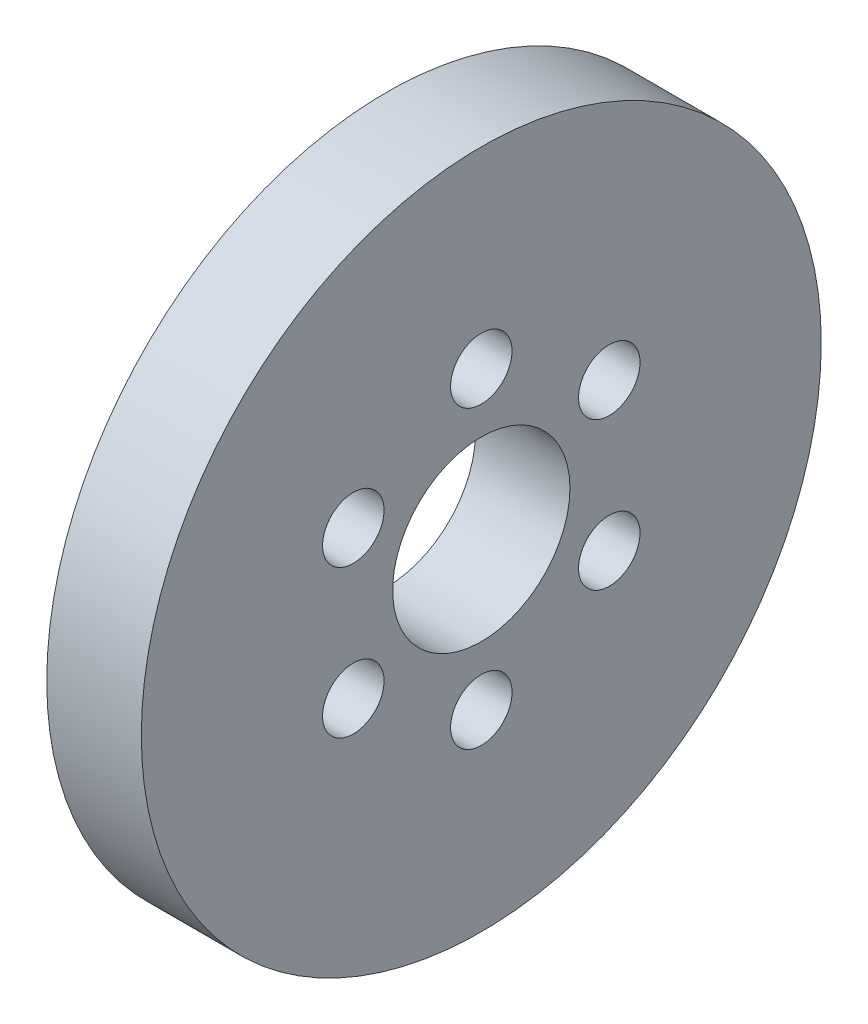
ISO-10303-21;
HEADER;
FILE_DESCRIPTION(('STEP AP214'),'2;1');
FILE_NAME('part.step','',(''),(''),'','','');
FILE_SCHEMA(('AUTOMOTIVE_DESIGN { 1 0 10303 214 1 1 1 1 }'));
ENDSEC;
DATA;
#1=APPLICATION_CONTEXT('core data for automotive mechanical design processes');
#2=APPLICATION_PROTOCOL_DEFINITION('international standard','automotive_design',2000,#1);
#3=PRODUCT_CONTEXT('',#1,'mechanical');
#4=PRODUCT('Part','Part','',(#3));
#5=PRODUCT_RELATED_PRODUCT_CATEGORY('part','',(#4));
#6=PRODUCT_DEFINITION_FORMATION('','',#4);
#7=PRODUCT_DEFINITION_CONTEXT('part definition',#1,'design');
#8=PRODUCT_DEFINITION('design','',#6,#7);
#9=PRODUCT_DEFINITION_SHAPE('','',#8);
#10=(LENGTH_UNIT() NAMED_UNIT(*) SI_UNIT(.MILLI.,.METRE.));
#11=(NAMED_UNIT(*) PLANE_ANGLE_UNIT() SI_UNIT($,.RADIAN.));
#12=(NAMED_UNIT(*) SI_UNIT($,.STERADIAN.) SOLID_ANGLE_UNIT());
#13=UNCERTAINTY_MEASURE_WITH_UNIT(LENGTH_MEASURE(1.E-05),#10,'distance_accuracy_value','');
#14=(GEOMETRIC_REPRESENTATION_CONTEXT(3) GLOBAL_UNCERTAINTY_ASSIGNED_CONTEXT((#13)) GLOBAL_UNIT_ASSIGNED_CONTEXT((#10,
#11,#12)) REPRESENTATION_CONTEXT('',''));
#15=CARTESIAN_POINT('',(0.,0.,0.));
#16=DIRECTION('',(0.,0.,1.));
#17=DIRECTION('',(1.,0.,0.));
#18=AXIS2_PLACEMENT_3D('',#15,#16,#17);
#19=CARTESIAN_POINT('',(5.08,0.,0.));
#20=DIRECTION('',(-1.,0.,0.));
#21=DIRECTION('',(0.,0.,1.));
#22=AXIS2_PLACEMENT_3D('',#19,#20,#21);
#23=CYLINDRICAL_SURFACE('',#22,18.26006);
#24=CARTESIAN_POINT('',(5.08,0.,0.));
#25=DIRECTION('',(1.,0.,0.));
#26=DIRECTION('',(0.,0.,-1.));
#27=AXIS2_PLACEMENT_3D('',#24,#25,#26);
#28=CIRCLE('',#27,18.26006);
#29=CARTESIAN_POINT('',(5.08,0.,-18.26006));
#30=VERTEX_POINT('',#29);
#31=EDGE_CURVE('E10',#30,#30,#28,.T.);
#32=ORIENTED_EDGE('',*,*,#31,.F.);
#33=EDGE_LOOP('',(#32));
#34=FACE_BOUND('',#33,.T.);
#35=CARTESIAN_POINT('',(0.,0.,0.));
#36=DIRECTION('',(1.,0.,0.));
#37=DIRECTION('',(0.,0.,-1.));
#38=AXIS2_PLACEMENT_3D('',#35,#36,#37);
#39=CIRCLE('',#38,18.26006);
#40=CARTESIAN_POINT('',(0.,0.,-18.26006));
#41=VERTEX_POINT('',#40);
#42=EDGE_CURVE('E36',#41,#41,#39,.T.);
#43=ORIENTED_EDGE('',*,*,#42,.T.);
#44=EDGE_LOOP('',(#43));
#45=FACE_BOUND('',#44,.T.);
#46=ADVANCED_FACE('F33',(#34,#45),#23,.T.);
#47=CARTESIAN_POINT('',(5.08,0.,0.));
#48=DIRECTION('',(1.,0.,0.));
#49=DIRECTION('',(0.,0.,-1.));
#50=AXIS2_PLACEMENT_3D('',#47,#48,#49);
#51=PLANE('',#50);
#52=CARTESIAN_POINT('',(5.08,0.,0.));
#53=DIRECTION('',(1.,0.,0.));
#54=DIRECTION('',(0.,0.,-1.));
#55=AXIS2_PLACEMENT_3D('',#52,#53,#54);
#56=CIRCLE('',#55,4.76249999999999);
#57=CARTESIAN_POINT('',(5.08,0.,-4.76249999999999));
#58=VERTEX_POINT('',#57);
#59=EDGE_CURVE('E83',#58,#58,#56,.T.);
#60=ORIENTED_EDGE('',*,*,#59,.F.);
#61=EDGE_LOOP('',(#60));
#62=FACE_BOUND('',#61,.T.);
#63=CARTESIAN_POINT('',(5.08,7.9375,0.));
#64=DIRECTION('',(1.,0.,0.));
#65=DIRECTION('',(0.,0.,-1.));
#66=AXIS2_PLACEMENT_3D('',#63,#64,#65);
#67=CIRCLE('',#66,1.65099999999999);
#68=CARTESIAN_POINT('',(5.08,7.9375,-1.65099999999999));
#69=VERTEX_POINT('',#68);
#70=EDGE_CURVE('E77',#69,#69,#67,.T.);
#71=ORIENTED_EDGE('',*,*,#70,.F.);
#72=EDGE_LOOP('',(#71));
#73=FACE_BOUND('',#72,.T.);
#74=CARTESIAN_POINT('',(5.08,3.96874999999998,-6.87407664253899));
#75=DIRECTION('',(1.,0.,0.));
#76=DIRECTION('',(0.,0.,-1.));
#77=AXIS2_PLACEMENT_3D('',#74,#75,#76);
#78=CIRCLE('',#77,1.65099999999999);
#79=CARTESIAN_POINT('',(5.08,3.96874999999998,-8.52507664253898));
#80=VERTEX_POINT('',#79);
#81=EDGE_CURVE('E71',#80,#80,#78,.T.);
#82=ORIENTED_EDGE('',*,*,#81,.F.);
#83=EDGE_LOOP('',(#82));
#84=FACE_BOUND('',#83,.T.);
#85=CARTESIAN_POINT('',(5.08,-3.96875000000003,-6.87407664253896));
#86=DIRECTION('',(1.,0.,0.));
#87=DIRECTION('',(0.,0.,-1.));
#88=AXIS2_PLACEMENT_3D('',#85,#86,#87);
#89=CIRCLE('',#88,1.65099999999999);
#90=CARTESIAN_POINT('',(5.08,-3.96875000000003,-8.52507664253895));
#91=VERTEX_POINT('',#90);
#92=EDGE_CURVE('E65',#91,#91,#89,.T.);
#93=ORIENTED_EDGE('',*,*,#92,.F.);
#94=EDGE_LOOP('',(#93));
#95=FACE_BOUND('',#94,.T.);
#96=CARTESIAN_POINT('',(5.08,-7.9375,0.));
#97=DIRECTION('',(1.,0.,0.));
#98=DIRECTION('',(0.,0.,-1.));
#99=AXIS2_PLACEMENT_3D('',#96,#97,#98);
#100=CIRCLE('',#99,1.65099999999999);
#101=CARTESIAN_POINT('',(5.08,-7.9375,-1.65099999999993));
#102=VERTEX_POINT('',#101);
#103=EDGE_CURVE('E59',#102,#102,#100,.T.);
#104=ORIENTED_EDGE('',*,*,#103,.F.);
#105=EDGE_LOOP('',(#104));
#106=FACE_BOUND('',#105,.T.);
#107=CARTESIAN_POINT('',(5.08,-3.96874999999994,6.87407664253902));
#108=DIRECTION('',(1.,0.,0.));
#109=DIRECTION('',(0.,0.,-1.));
#110=AXIS2_PLACEMENT_3D('',#107,#108,#109);
#111=CIRCLE('',#110,1.65099999999999);
#112=CARTESIAN_POINT('',(5.08,-3.96874999999994,5.22307664253903));
#113=VERTEX_POINT('',#112);
#114=EDGE_CURVE('E53',#113,#113,#111,.T.);
#115=ORIENTED_EDGE('',*,*,#114,.F.);
#116=EDGE_LOOP('',(#115));
#117=FACE_BOUND('',#116,.T.);
#118=CARTESIAN_POINT('',(5.08,3.96875000000008,6.87407664253894));
#119=DIRECTION('',(1.,0.,0.));
#120=DIRECTION('',(0.,0.,-1.));
#121=AXIS2_PLACEMENT_3D('',#118,#119,#120);
#122=CIRCLE('',#121,1.65099999999999);
#123=CARTESIAN_POINT('',(5.08,3.96875000000008,5.22307664253895));
#124=VERTEX_POINT('',#123);
#125=EDGE_CURVE('E47',#124,#124,#122,.T.);
#126=ORIENTED_EDGE('',*,*,#125,.F.);
#127=EDGE_LOOP('',(#126));
#128=FACE_BOUND('',#127,.T.);
#129=ORIENTED_EDGE('',*,*,#31,.T.);
#130=EDGE_LOOP('',(#129));
#131=FACE_BOUND('',#130,.T.);
#132=ADVANCED_FACE('F90',(#62,#73,#84,#95,#106,#117,#128,#131),#51,.T.);
#133=CARTESIAN_POINT('',(0.,0.,0.));
#134=DIRECTION('',(1.,0.,0.));
#135=DIRECTION('',(0.,0.,-1.));
#136=AXIS2_PLACEMENT_3D('',#133,#134,#135);
#137=PLANE('',#136);
#138=CARTESIAN_POINT('',(0.,0.,0.));
#139=DIRECTION('',(1.,0.,0.));
#140=DIRECTION('',(0.,0.,-1.));
#141=AXIS2_PLACEMENT_3D('',#138,#139,#140);
#142=CIRCLE('',#141,4.76249999999999);
#143=CARTESIAN_POINT('',(0.,0.,-4.76249999999999));
#144=VERTEX_POINT('',#143);
#145=EDGE_CURVE('E80',#144,#144,#142,.T.);
#146=ORIENTED_EDGE('',*,*,#145,.T.);
#147=EDGE_LOOP('',(#146));
#148=FACE_BOUND('',#147,.T.);
#149=CARTESIAN_POINT('',(0.,7.9375,0.));
#150=DIRECTION('',(1.,0.,0.));
#151=DIRECTION('',(0.,0.,-1.));
#152=AXIS2_PLACEMENT_3D('',#149,#150,#151);
#153=CIRCLE('',#152,1.65099999999999);
#154=CARTESIAN_POINT('',(0.,7.9375,-1.65099999999999));
#155=VERTEX_POINT('',#154);
#156=EDGE_CURVE('E74',#155,#155,#153,.T.);
#157=ORIENTED_EDGE('',*,*,#156,.T.);
#158=EDGE_LOOP('',(#157));
#159=FACE_BOUND('',#158,.T.);
#160=CARTESIAN_POINT('',(0.,3.96874999999998,-6.87407664253899));
#161=DIRECTION('',(1.,0.,0.));
#162=DIRECTION('',(0.,0.,-1.));
#163=AXIS2_PLACEMENT_3D('',#160,#161,#162);
#164=CIRCLE('',#163,1.65099999999999);
#165=CARTESIAN_POINT('',(0.,3.96874999999998,-8.52507664253898));
#166=VERTEX_POINT('',#165);
#167=EDGE_CURVE('E68',#166,#166,#164,.T.);
#168=ORIENTED_EDGE('',*,*,#167,.T.);
#169=EDGE_LOOP('',(#168));
#170=FACE_BOUND('',#169,.T.);
#171=CARTESIAN_POINT('',(0.,-3.96875000000003,-6.87407664253896));
#172=DIRECTION('',(1.,0.,0.));
#173=DIRECTION('',(0.,0.,-1.));
#174=AXIS2_PLACEMENT_3D('',#171,#172,#173);
#175=CIRCLE('',#174,1.65099999999999);
#176=CARTESIAN_POINT('',(0.,-3.96875000000003,-8.52507664253896));
#177=VERTEX_POINT('',#176);
#178=EDGE_CURVE('E62',#177,#177,#175,.T.);
#179=ORIENTED_EDGE('',*,*,#178,.T.);
#180=EDGE_LOOP('',(#179));
#181=FACE_BOUND('',#180,.T.);
#182=CARTESIAN_POINT('',(0.,-7.9375,0.));
#183=DIRECTION('',(1.,0.,0.));
#184=DIRECTION('',(0.,0.,-1.));
#185=AXIS2_PLACEMENT_3D('',#182,#183,#184);
#186=CIRCLE('',#185,1.65099999999999);
#187=CARTESIAN_POINT('',(0.,-7.9375,-1.65099999999994));
#188=VERTEX_POINT('',#187);
#189=EDGE_CURVE('E56',#188,#188,#186,.T.);
#190=ORIENTED_EDGE('',*,*,#189,.T.);
#191=EDGE_LOOP('',(#190));
#192=FACE_BOUND('',#191,.T.);
#193=CARTESIAN_POINT('',(0.,-3.96874999999994,6.87407664253902));
#194=DIRECTION('',(1.,0.,0.));
#195=DIRECTION('',(0.,0.,-1.));
#196=AXIS2_PLACEMENT_3D('',#193,#194,#195);
#197=CIRCLE('',#196,1.65099999999999);
#198=CARTESIAN_POINT('',(0.,-3.96874999999994,5.22307664253903));
#199=VERTEX_POINT('',#198);
#200=EDGE_CURVE('E50',#199,#199,#197,.T.);
#201=ORIENTED_EDGE('',*,*,#200,.T.);
#202=EDGE_LOOP('',(#201));
#203=FACE_BOUND('',#202,.T.);
#204=CARTESIAN_POINT('',(0.,3.96875000000008,6.87407664253894));
#205=DIRECTION('',(1.,0.,0.));
#206=DIRECTION('',(0.,0.,-1.));
#207=AXIS2_PLACEMENT_3D('',#204,#205,#206);
#208=CIRCLE('',#207,1.65099999999999);
#209=CARTESIAN_POINT('',(0.,3.96875000000008,5.22307664253894));
#210=VERTEX_POINT('',#209);
#211=EDGE_CURVE('E43',#210,#210,#208,.T.);
#212=ORIENTED_EDGE('',*,*,#211,.T.);
#213=EDGE_LOOP('',(#212));
#214=FACE_BOUND('',#213,.T.);
#215=ORIENTED_EDGE('',*,*,#42,.F.);
#216=EDGE_LOOP('',(#215));
#217=FACE_BOUND('',#216,.T.);
#218=ADVANCED_FACE('F93',(#148,#159,#170,#181,#192,#203,#214,#217),#137,.F.);
#219=CARTESIAN_POINT('',(5.08,3.96875000000008,6.87407664253894));
#220=DIRECTION('',(1.,0.,0.));
#221=DIRECTION('',(0.,0.,-1.));
#222=AXIS2_PLACEMENT_3D('',#219,#220,#221);
#223=CYLINDRICAL_SURFACE('',#222,1.65099999999999);
#224=ORIENTED_EDGE('',*,*,#211,.F.);
#225=EDGE_LOOP('',(#224));
#226=FACE_BOUND('',#225,.T.);
#227=ORIENTED_EDGE('',*,*,#125,.T.);
#228=EDGE_LOOP('',(#227));
#229=FACE_BOUND('',#228,.T.);
#230=ADVANCED_FACE('F107',(#226,#229),#223,.F.);
#231=CARTESIAN_POINT('',(5.08,-3.96874999999994,6.87407664253902));
#232=DIRECTION('',(1.,0.,0.));
#233=DIRECTION('',(0.,0.,-1.));
#234=AXIS2_PLACEMENT_3D('',#231,#232,#233);
#235=CYLINDRICAL_SURFACE('',#234,1.65099999999999);
#236=ORIENTED_EDGE('',*,*,#200,.F.);
#237=EDGE_LOOP('',(#236));
#238=FACE_BOUND('',#237,.T.);
#239=ORIENTED_EDGE('',*,*,#114,.T.);
#240=EDGE_LOOP('',(#239));
#241=FACE_BOUND('',#240,.T.);
#242=ADVANCED_FACE('F109',(#238,#241),#235,.F.);
#243=CARTESIAN_POINT('',(5.08,-7.9375,0.));
#244=DIRECTION('',(1.,0.,0.));
#245=DIRECTION('',(0.,0.,-1.));
#246=AXIS2_PLACEMENT_3D('',#243,#244,#245);
#247=CYLINDRICAL_SURFACE('',#246,1.65099999999999);
#248=ORIENTED_EDGE('',*,*,#189,.F.);
#249=EDGE_LOOP('',(#248));
#250=FACE_BOUND('',#249,.T.);
#251=ORIENTED_EDGE('',*,*,#103,.T.);
#252=EDGE_LOOP('',(#251));
#253=FACE_BOUND('',#252,.T.);
#254=ADVANCED_FACE('F116',(#250,#253),#247,.F.);
#255=CARTESIAN_POINT('',(5.08,-3.96875000000003,-6.87407664253896));
#256=DIRECTION('',(1.,0.,0.));
#257=DIRECTION('',(0.,0.,-1.));
#258=AXIS2_PLACEMENT_3D('',#255,#256,#257);
#259=CYLINDRICAL_SURFACE('',#258,1.65099999999999);
#260=ORIENTED_EDGE('',*,*,#178,.F.);
#261=EDGE_LOOP('',(#260));
#262=FACE_BOUND('',#261,.T.);
#263=ORIENTED_EDGE('',*,*,#92,.T.);
#264=EDGE_LOOP('',(#263));
#265=FACE_BOUND('',#264,.T.);
#266=ADVANCED_FACE('F162',(#262,#265),#259,.F.);
#267=CARTESIAN_POINT('',(5.08,3.96874999999998,-6.87407664253899));
#268=DIRECTION('',(1.,0.,0.));
#269=DIRECTION('',(0.,0.,-1.));
#270=AXIS2_PLACEMENT_3D('',#267,#268,#269);
#271=CYLINDRICAL_SURFACE('',#270,1.65099999999999);
#272=ORIENTED_EDGE('',*,*,#167,.F.);
#273=EDGE_LOOP('',(#272));
#274=FACE_BOUND('',#273,.T.);
#275=ORIENTED_EDGE('',*,*,#81,.T.);
#276=EDGE_LOOP('',(#275));
#277=FACE_BOUND('',#276,.T.);
#278=ADVANCED_FACE('F155',(#274,#277),#271,.F.);
#279=CARTESIAN_POINT('',(5.08,7.9375,0.));
#280=DIRECTION('',(1.,0.,0.));
#281=DIRECTION('',(0.,0.,-1.));
#282=AXIS2_PLACEMENT_3D('',#279,#280,#281);
#283=CYLINDRICAL_SURFACE('',#282,1.65099999999999);
#284=ORIENTED_EDGE('',*,*,#156,.F.);
#285=EDGE_LOOP('',(#284));
#286=FACE_BOUND('',#285,.T.);
#287=ORIENTED_EDGE('',*,*,#70,.T.);
#288=EDGE_LOOP('',(#287));
#289=FACE_BOUND('',#288,.T.);
#290=ADVANCED_FACE('F146',(#286,#289),#283,.F.);
#291=CARTESIAN_POINT('',(5.08,0.,0.));
#292=DIRECTION('',(1.,0.,0.));
#293=DIRECTION('',(0.,0.,-1.));
#294=AXIS2_PLACEMENT_3D('',#291,#292,#293);
#295=CYLINDRICAL_SURFACE('',#294,4.76249999999999);
#296=ORIENTED_EDGE('',*,*,#59,.T.);
#297=EDGE_LOOP('',(#296));
#298=FACE_BOUND('',#297,.T.);
#299=ORIENTED_EDGE('',*,*,#145,.F.);
#300=EDGE_LOOP('',(#299));
#301=FACE_BOUND('',#300,.T.);
#302=ADVANCED_FACE('F87',(#298,#301),#295,.F.);
#303=CLOSED_SHELL('',(#46,#132,#218,#230,#242,#254,#266,#278,#290,#302));
#304=MANIFOLD_SOLID_BREP('B2',#303);
#305=ADVANCED_BREP_SHAPE_REPRESENTATION('',(#18,#304),#14);
#306=SHAPE_DEFINITION_REPRESENTATION(#9,#305);
ENDSEC;
END-ISO-10303-21;
